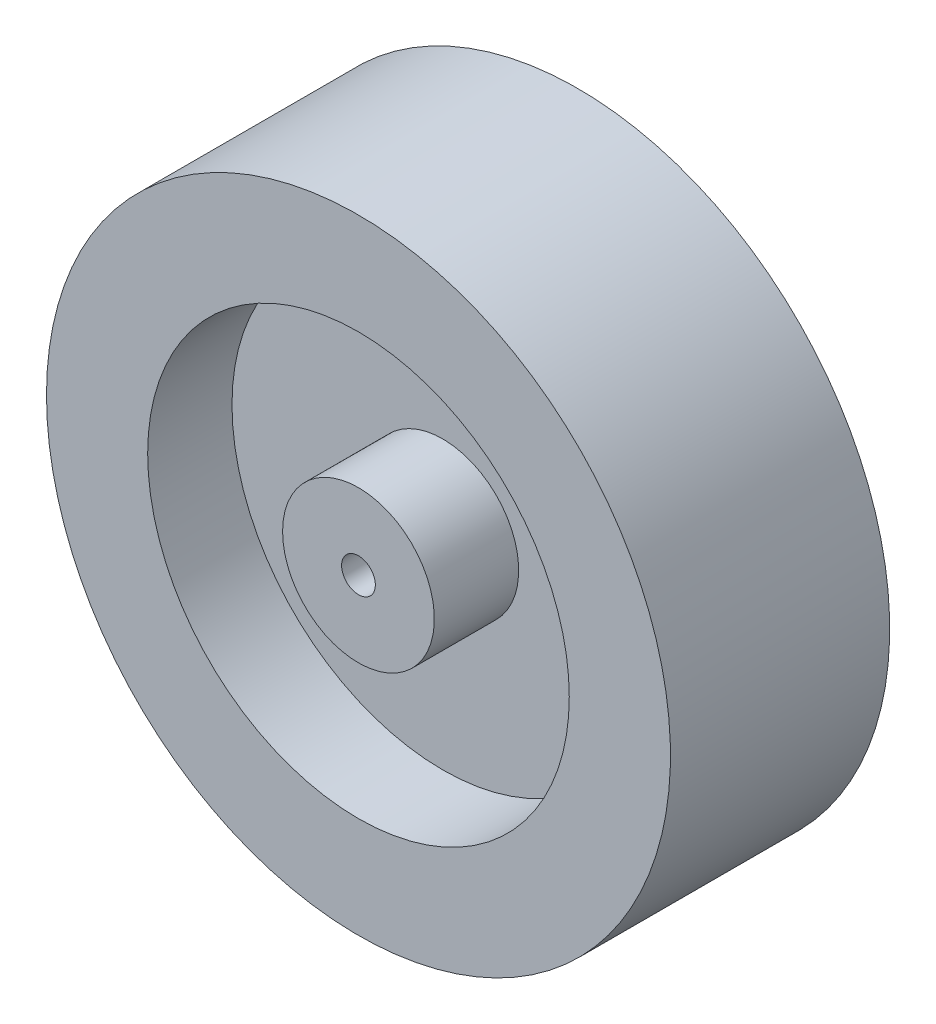
ISO-10303-21;
HEADER;
FILE_DESCRIPTION(('STEP AP214'),'2;1');
FILE_NAME('part.step','',(''),(''),'','','');
FILE_SCHEMA(('AUTOMOTIVE_DESIGN { 1 0 10303 214 1 1 1 1 }'));
ENDSEC;
DATA;
#1=APPLICATION_CONTEXT('core data for automotive mechanical design processes');
#2=APPLICATION_PROTOCOL_DEFINITION('international standard','automotive_design',2000,#1);
#3=PRODUCT_CONTEXT('',#1,'mechanical');
#4=PRODUCT('Part','Part','',(#3));
#5=PRODUCT_RELATED_PRODUCT_CATEGORY('part','',(#4));
#6=PRODUCT_DEFINITION_FORMATION('','',#4);
#7=PRODUCT_DEFINITION_CONTEXT('part definition',#1,'design');
#8=PRODUCT_DEFINITION('design','',#6,#7);
#9=PRODUCT_DEFINITION_SHAPE('','',#8);
#10=(LENGTH_UNIT() NAMED_UNIT(*) SI_UNIT(.MILLI.,.METRE.));
#11=(NAMED_UNIT(*) PLANE_ANGLE_UNIT() SI_UNIT($,.RADIAN.));
#12=(NAMED_UNIT(*) SI_UNIT($,.STERADIAN.) SOLID_ANGLE_UNIT());
#13=UNCERTAINTY_MEASURE_WITH_UNIT(LENGTH_MEASURE(1.E-05),#10,'distance_accuracy_value','');
#14=(GEOMETRIC_REPRESENTATION_CONTEXT(3) GLOBAL_UNCERTAINTY_ASSIGNED_CONTEXT((#13)) GLOBAL_UNIT_ASSIGNED_CONTEXT((#10,
#11,#12)) REPRESENTATION_CONTEXT('',''));
#15=CARTESIAN_POINT('',(0.,0.,0.));
#16=DIRECTION('',(0.,0.,1.));
#17=DIRECTION('',(1.,0.,0.));
#18=AXIS2_PLACEMENT_3D('',#15,#16,#17);
#19=CARTESIAN_POINT('',(0.,0.,26.));
#20=DIRECTION('',(0.,0.,1.));
#21=DIRECTION('',(1.,0.,0.));
#22=AXIS2_PLACEMENT_3D('',#19,#20,#21);
#23=PLANE('',#22);
#24=CARTESIAN_POINT('',(0.,0.,26.));
#25=DIRECTION('',(0.,0.,1.));
#26=DIRECTION('',(1.,0.,0.));
#27=AXIS2_PLACEMENT_3D('',#24,#25,#26);
#28=CIRCLE('',#27,2.);
#29=CARTESIAN_POINT('',(-2.,0.,26.));
#30=VERTEX_POINT('',#29);
#31=EDGE_CURVE('E50',#30,#30,#28,.T.);
#32=ORIENTED_EDGE('',*,*,#31,.F.);
#33=EDGE_LOOP('',(#32));
#34=FACE_BOUND('',#33,.T.);
#35=CARTESIAN_POINT('',(0.,0.,26.));
#36=DIRECTION('',(0.,0.,-1.));
#37=DIRECTION('',(-1.,0.,0.));
#38=AXIS2_PLACEMENT_3D('',#35,#36,#37);
#39=CIRCLE('',#38,9.);
#40=CARTESIAN_POINT('',(-9.,0.,26.));
#41=VERTEX_POINT('',#40);
#42=EDGE_CURVE('E84',#41,#41,#39,.T.);
#43=ORIENTED_EDGE('',*,*,#42,.F.);
#44=EDGE_LOOP('',(#43));
#45=FACE_BOUND('',#44,.T.);
#46=ADVANCED_FACE('F37',(#34,#45),#23,.T.);
#47=CARTESIAN_POINT('',(0.,0.,0.));
#48=DIRECTION('',(0.,0.,1.));
#49=DIRECTION('',(1.,0.,0.));
#50=AXIS2_PLACEMENT_3D('',#47,#48,#49);
#51=PLANE('',#50);
#52=CARTESIAN_POINT('',(0.,0.,0.));
#53=DIRECTION('',(0.,0.,1.));
#54=DIRECTION('',(1.,0.,0.));
#55=AXIS2_PLACEMENT_3D('',#52,#53,#54);
#56=CIRCLE('',#55,2.);
#57=CARTESIAN_POINT('',(-2.,0.,0.));
#58=VERTEX_POINT('',#57);
#59=EDGE_CURVE('E52',#58,#58,#56,.T.);
#60=ORIENTED_EDGE('',*,*,#59,.T.);
#61=EDGE_LOOP('',(#60));
#62=FACE_BOUND('',#61,.T.);
#63=CARTESIAN_POINT('',(0.,0.,0.));
#64=DIRECTION('',(0.,0.,-1.));
#65=DIRECTION('',(-1.,0.,0.));
#66=AXIS2_PLACEMENT_3D('',#63,#64,#65);
#67=CIRCLE('',#66,9.);
#68=CARTESIAN_POINT('',(-9.,0.,0.));
#69=VERTEX_POINT('',#68);
#70=EDGE_CURVE('E68',#69,#69,#67,.T.);
#71=ORIENTED_EDGE('',*,*,#70,.T.);
#72=EDGE_LOOP('',(#71));
#73=FACE_BOUND('',#72,.T.);
#74=ADVANCED_FACE('F102',(#62,#73),#51,.F.);
#75=CARTESIAN_POINT('',(0.,0.,26.));
#76=DIRECTION('',(0.,0.,-1.));
#77=DIRECTION('',(-1.,0.,0.));
#78=AXIS2_PLACEMENT_3D('',#75,#76,#77);
#79=CIRCLE('',#78,25.);
#80=CARTESIAN_POINT('',(-25.,0.,26.));
#81=VERTEX_POINT('',#80);
#82=EDGE_CURVE('E76',#81,#81,#79,.T.);
#83=ORIENTED_EDGE('',*,*,#82,.T.);
#84=EDGE_LOOP('',(#83));
#85=FACE_BOUND('',#84,.T.);
#86=CARTESIAN_POINT('',(0.,0.,26.));
#87=DIRECTION('',(0.,0.,1.));
#88=DIRECTION('',(1.,0.,0.));
#89=AXIS2_PLACEMENT_3D('',#86,#87,#88);
#90=CIRCLE('',#89,37.);
#91=CARTESIAN_POINT('',(-37.,0.,26.));
#92=VERTEX_POINT('',#91);
#93=EDGE_CURVE('E10',#92,#92,#90,.T.);
#94=ORIENTED_EDGE('',*,*,#93,.T.);
#95=EDGE_LOOP('',(#94));
#96=FACE_BOUND('',#95,.T.);
#97=ADVANCED_FACE('F105',(#85,#96),#23,.T.);
#98=CARTESIAN_POINT('',(0.,0.,0.));
#99=DIRECTION('',(0.,0.,-1.));
#100=DIRECTION('',(-1.,0.,0.));
#101=AXIS2_PLACEMENT_3D('',#98,#99,#100);
#102=CIRCLE('',#101,25.);
#103=CARTESIAN_POINT('',(-25.,0.,0.));
#104=VERTEX_POINT('',#103);
#105=EDGE_CURVE('E60',#104,#104,#102,.T.);
#106=ORIENTED_EDGE('',*,*,#105,.F.);
#107=EDGE_LOOP('',(#106));
#108=FACE_BOUND('',#107,.T.);
#109=CARTESIAN_POINT('',(0.,0.,0.));
#110=DIRECTION('',(0.,0.,1.));
#111=DIRECTION('',(1.,0.,0.));
#112=AXIS2_PLACEMENT_3D('',#109,#110,#111);
#113=CIRCLE('',#112,37.);
#114=CARTESIAN_POINT('',(-37.,0.,0.));
#115=VERTEX_POINT('',#114);
#116=EDGE_CURVE('E41',#115,#115,#113,.T.);
#117=ORIENTED_EDGE('',*,*,#116,.F.);
#118=EDGE_LOOP('',(#117));
#119=FACE_BOUND('',#118,.T.);
#120=ADVANCED_FACE('F110',(#108,#119),#51,.F.);
#121=CARTESIAN_POINT('',(0.,0.,26.));
#122=DIRECTION('',(0.,0.,-1.));
#123=DIRECTION('',(-1.,0.,0.));
#124=AXIS2_PLACEMENT_3D('',#121,#122,#123);
#125=CYLINDRICAL_SURFACE('',#124,37.);
#126=CARTESIAN_POINT('',(-37.,0.,26.));
#127=CARTESIAN_POINT('',(-37.,0.,25.7291666666667));
#128=CARTESIAN_POINT('',(-37.,0.,25.4583333333333));
#129=CARTESIAN_POINT('',(-37.,0.,24.9166666666667));
#130=CARTESIAN_POINT('',(-37.,0.,24.6458333333333));
#131=CARTESIAN_POINT('',(-37.,0.,24.1041666666667));
#132=CARTESIAN_POINT('',(-37.,0.,23.8333333333333));
#133=CARTESIAN_POINT('',(-37.,0.,23.2916666666667));
#134=CARTESIAN_POINT('',(-37.,0.,23.0208333333333));
#135=CARTESIAN_POINT('',(-37.,0.,22.4791666666667));
#136=CARTESIAN_POINT('',(-37.,0.,22.2083333333333));
#137=CARTESIAN_POINT('',(-37.,0.,21.6666666666667));
#138=CARTESIAN_POINT('',(-37.,0.,21.3958333333333));
#139=CARTESIAN_POINT('',(-37.,0.,20.8541666666667));
#140=CARTESIAN_POINT('',(-37.,0.,20.5833333333333));
#141=CARTESIAN_POINT('',(-37.,0.,20.0416666666667));
#142=CARTESIAN_POINT('',(-37.,0.,19.7708333333333));
#143=CARTESIAN_POINT('',(-37.,0.,19.2291666666667));
#144=CARTESIAN_POINT('',(-37.,0.,18.9583333333333));
#145=CARTESIAN_POINT('',(-37.,0.,18.4166666666667));
#146=CARTESIAN_POINT('',(-37.,0.,18.1458333333333));
#147=CARTESIAN_POINT('',(-37.,0.,17.6041666666667));
#148=CARTESIAN_POINT('',(-37.,0.,17.3333333333333));
#149=CARTESIAN_POINT('',(-37.,0.,16.7916666666667));
#150=CARTESIAN_POINT('',(-37.,0.,16.5208333333333));
#151=CARTESIAN_POINT('',(-37.,0.,15.9791666666667));
#152=CARTESIAN_POINT('',(-37.,0.,15.7083333333333));
#153=CARTESIAN_POINT('',(-37.,0.,15.1666666666667));
#154=CARTESIAN_POINT('',(-37.,0.,14.8958333333333));
#155=CARTESIAN_POINT('',(-37.,0.,14.3541666666667));
#156=CARTESIAN_POINT('',(-37.,0.,14.0833333333333));
#157=CARTESIAN_POINT('',(-37.,0.,13.5416666666667));
#158=CARTESIAN_POINT('',(-37.,0.,13.2708333333333));
#159=CARTESIAN_POINT('',(-37.,0.,12.7291666666667));
#160=CARTESIAN_POINT('',(-37.,0.,12.4583333333333));
#161=CARTESIAN_POINT('',(-37.,0.,11.9166666666667));
#162=CARTESIAN_POINT('',(-37.,0.,11.6458333333333));
#163=CARTESIAN_POINT('',(-37.,0.,11.1041666666667));
#164=CARTESIAN_POINT('',(-37.,0.,10.8333333333333));
#165=CARTESIAN_POINT('',(-37.,0.,10.2916666666667));
#166=CARTESIAN_POINT('',(-37.,0.,10.0208333333333));
#167=CARTESIAN_POINT('',(-37.,0.,9.47916666666667));
#168=CARTESIAN_POINT('',(-37.,0.,9.20833333333333));
#169=CARTESIAN_POINT('',(-37.,0.,8.66666666666667));
#170=CARTESIAN_POINT('',(-37.,0.,8.39583333333333));
#171=CARTESIAN_POINT('',(-37.,0.,7.85416666666667));
#172=CARTESIAN_POINT('',(-37.,0.,7.58333333333333));
#173=CARTESIAN_POINT('',(-37.,0.,7.04166666666667));
#174=CARTESIAN_POINT('',(-37.,0.,6.77083333333333));
#175=CARTESIAN_POINT('',(-37.,0.,6.22916666666667));
#176=CARTESIAN_POINT('',(-37.,0.,5.95833333333333));
#177=CARTESIAN_POINT('',(-37.,0.,5.41666666666667));
#178=CARTESIAN_POINT('',(-37.,0.,5.14583333333333));
#179=CARTESIAN_POINT('',(-37.,0.,4.60416666666667));
#180=CARTESIAN_POINT('',(-37.,0.,4.33333333333333));
#181=CARTESIAN_POINT('',(-37.,0.,3.79166666666667));
#182=CARTESIAN_POINT('',(-37.,0.,3.52083333333333));
#183=CARTESIAN_POINT('',(-37.,0.,2.97916666666667));
#184=CARTESIAN_POINT('',(-37.,0.,2.70833333333333));
#185=CARTESIAN_POINT('',(-37.,0.,2.16666666666667));
#186=CARTESIAN_POINT('',(-37.,0.,1.89583333333333));
#187=CARTESIAN_POINT('',(-37.,0.,1.35416666666667));
#188=CARTESIAN_POINT('',(-37.,0.,1.08333333333333));
#189=CARTESIAN_POINT('',(-37.,0.,0.541666666666667));
#190=CARTESIAN_POINT('',(-37.,0.,0.270833333333334));
#191=CARTESIAN_POINT('',(-37.,0.,0.));
#192=B_SPLINE_CURVE_WITH_KNOTS('',3,(#126,#127,#128,#129,#130,#131,#132,#133,#134,#135,#136,
#137,#138,#139,#140,#141,#142,#143,#144,#145,#146,#147,#148,#149,#150,#151,#152,#153,#154,#155,
#156,#157,#158,#159,#160,#161,#162,#163,#164,#165,#166,#167,#168,#169,#170,#171,#172,#173,#174,
#175,#176,#177,#178,#179,#180,#181,#182,#183,#184,#185,#186,#187,#188,#189,#190,#191),
.UNSPECIFIED.,.F.,.F.,(4,2,2,2,2,2,2,2,2,2,2,2,2,2,2,2,2,2,2,2,2,2,2,2,2,2,2,2,2,2,2,2,4),(0.,
0.812500000000001,1.625,2.4375,3.25,4.0625,4.875,5.6875,6.5,7.3125,8.125,8.9375,9.75,10.5625,
11.375,12.1875,13.,13.8125,14.625,15.4375,16.25,17.0625,17.875,18.6875,19.5,20.3125,21.125,
21.9375,22.75,23.5625,24.375,25.1875,26.),.UNSPECIFIED.);
#193=EDGE_CURVE('BSEAM39',#92,#115,#192,.T.);
#194=ORIENTED_EDGE('',*,*,#93,.F.);
#195=ORIENTED_EDGE('',*,*,#116,.T.);
#196=ORIENTED_EDGE('',*,*,#193,.T.);
#197=ORIENTED_EDGE('',*,*,#193,.F.);
#198=EDGE_LOOP('',(#194,#196,#195,#197));
#199=FACE_BOUND('',#198,.T.);
#200=ADVANCED_FACE('F39',(#199),#125,.T.);
#201=CARTESIAN_POINT('',(0.,0.,26.));
#202=DIRECTION('',(0.,0.,-1.));
#203=DIRECTION('',(-1.,0.,0.));
#204=AXIS2_PLACEMENT_3D('',#201,#202,#203);
#205=CYLINDRICAL_SURFACE('',#204,2.);
#206=CARTESIAN_POINT('',(-2.,0.,26.));
#207=CARTESIAN_POINT('',(-2.,0.,25.7291666666667));
#208=CARTESIAN_POINT('',(-2.,0.,25.4583333333333));
#209=CARTESIAN_POINT('',(-2.,0.,24.9166666666667));
#210=CARTESIAN_POINT('',(-2.,0.,24.6458333333333));
#211=CARTESIAN_POINT('',(-2.,0.,24.1041666666667));
#212=CARTESIAN_POINT('',(-2.,0.,23.8333333333333));
#213=CARTESIAN_POINT('',(-2.,0.,23.2916666666667));
#214=CARTESIAN_POINT('',(-2.,0.,23.0208333333333));
#215=CARTESIAN_POINT('',(-2.,0.,22.4791666666667));
#216=CARTESIAN_POINT('',(-2.,0.,22.2083333333333));
#217=CARTESIAN_POINT('',(-2.,0.,21.6666666666667));
#218=CARTESIAN_POINT('',(-2.,0.,21.3958333333333));
#219=CARTESIAN_POINT('',(-2.,0.,20.8541666666667));
#220=CARTESIAN_POINT('',(-2.,0.,20.5833333333333));
#221=CARTESIAN_POINT('',(-2.,0.,20.0416666666667));
#222=CARTESIAN_POINT('',(-2.,0.,19.7708333333333));
#223=CARTESIAN_POINT('',(-2.,0.,19.2291666666667));
#224=CARTESIAN_POINT('',(-2.,0.,18.9583333333333));
#225=CARTESIAN_POINT('',(-2.,0.,18.4166666666667));
#226=CARTESIAN_POINT('',(-2.,0.,18.1458333333333));
#227=CARTESIAN_POINT('',(-2.,0.,17.6041666666667));
#228=CARTESIAN_POINT('',(-2.,0.,17.3333333333333));
#229=CARTESIAN_POINT('',(-2.,0.,16.7916666666667));
#230=CARTESIAN_POINT('',(-2.,0.,16.5208333333333));
#231=CARTESIAN_POINT('',(-2.,0.,15.9791666666667));
#232=CARTESIAN_POINT('',(-2.,0.,15.7083333333333));
#233=CARTESIAN_POINT('',(-2.,0.,15.1666666666667));
#234=CARTESIAN_POINT('',(-2.,0.,14.8958333333333));
#235=CARTESIAN_POINT('',(-2.,0.,14.3541666666667));
#236=CARTESIAN_POINT('',(-2.,0.,14.0833333333333));
#237=CARTESIAN_POINT('',(-2.,0.,13.5416666666667));
#238=CARTESIAN_POINT('',(-2.,0.,13.2708333333333));
#239=CARTESIAN_POINT('',(-2.,0.,12.7291666666667));
#240=CARTESIAN_POINT('',(-2.,0.,12.4583333333333));
#241=CARTESIAN_POINT('',(-2.,0.,11.9166666666667));
#242=CARTESIAN_POINT('',(-2.,0.,11.6458333333333));
#243=CARTESIAN_POINT('',(-2.,0.,11.1041666666667));
#244=CARTESIAN_POINT('',(-2.,0.,10.8333333333333));
#245=CARTESIAN_POINT('',(-2.,0.,10.2916666666667));
#246=CARTESIAN_POINT('',(-2.,0.,10.0208333333333));
#247=CARTESIAN_POINT('',(-2.,0.,9.47916666666667));
#248=CARTESIAN_POINT('',(-2.,0.,9.20833333333333));
#249=CARTESIAN_POINT('',(-2.,0.,8.66666666666667));
#250=CARTESIAN_POINT('',(-2.,0.,8.39583333333333));
#251=CARTESIAN_POINT('',(-2.,0.,7.85416666666667));
#252=CARTESIAN_POINT('',(-2.,0.,7.58333333333333));
#253=CARTESIAN_POINT('',(-2.,0.,7.04166666666667));
#254=CARTESIAN_POINT('',(-2.,0.,6.77083333333333));
#255=CARTESIAN_POINT('',(-2.,0.,6.22916666666667));
#256=CARTESIAN_POINT('',(-2.,0.,5.95833333333333));
#257=CARTESIAN_POINT('',(-2.,0.,5.41666666666667));
#258=CARTESIAN_POINT('',(-2.,0.,5.14583333333333));
#259=CARTESIAN_POINT('',(-2.,0.,4.60416666666667));
#260=CARTESIAN_POINT('',(-2.,0.,4.33333333333333));
#261=CARTESIAN_POINT('',(-2.,0.,3.79166666666667));
#262=CARTESIAN_POINT('',(-2.,0.,3.52083333333333));
#263=CARTESIAN_POINT('',(-2.,0.,2.97916666666667));
#264=CARTESIAN_POINT('',(-2.,0.,2.70833333333333));
#265=CARTESIAN_POINT('',(-2.,0.,2.16666666666667));
#266=CARTESIAN_POINT('',(-2.,0.,1.89583333333333));
#267=CARTESIAN_POINT('',(-2.,0.,1.35416666666667));
#268=CARTESIAN_POINT('',(-2.,0.,1.08333333333333));
#269=CARTESIAN_POINT('',(-2.,0.,0.541666666666667));
#270=CARTESIAN_POINT('',(-2.,0.,0.270833333333334));
#271=CARTESIAN_POINT('',(-2.,0.,0.));
#272=B_SPLINE_CURVE_WITH_KNOTS('',3,(#206,#207,#208,#209,#210,#211,#212,#213,#214,#215,#216,
#217,#218,#219,#220,#221,#222,#223,#224,#225,#226,#227,#228,#229,#230,#231,#232,#233,#234,#235,
#236,#237,#238,#239,#240,#241,#242,#243,#244,#245,#246,#247,#248,#249,#250,#251,#252,#253,#254,
#255,#256,#257,#258,#259,#260,#261,#262,#263,#264,#265,#266,#267,#268,#269,#270,#271),
.UNSPECIFIED.,.F.,.F.,(4,2,2,2,2,2,2,2,2,2,2,2,2,2,2,2,2,2,2,2,2,2,2,2,2,2,2,2,2,2,2,2,4),(0.,
0.812500000000001,1.625,2.4375,3.25,4.0625,4.875,5.6875,6.5,7.3125,8.125,8.9375,9.75,10.5625,
11.375,12.1875,13.,13.8125,14.625,15.4375,16.25,17.0625,17.875,18.6875,19.5,20.3125,21.125,
21.9375,22.75,23.5625,24.375,25.1875,26.),.UNSPECIFIED.);
#273=EDGE_CURVE('BSEAM140',#30,#58,#272,.T.);
#274=ORIENTED_EDGE('',*,*,#31,.T.);
#275=ORIENTED_EDGE('',*,*,#59,.F.);
#276=ORIENTED_EDGE('',*,*,#273,.T.);
#277=ORIENTED_EDGE('',*,*,#273,.F.);
#278=EDGE_LOOP('',(#274,#276,#275,#277));
#279=FACE_BOUND('',#278,.T.);
#280=ADVANCED_FACE('F140',(#279),#205,.F.);
#281=CARTESIAN_POINT('',(0.,0.,10.));
#282=DIRECTION('',(0.,0.,-1.));
#283=DIRECTION('',(-1.,0.,0.));
#284=AXIS2_PLACEMENT_3D('',#281,#282,#283);
#285=CYLINDRICAL_SURFACE('',#284,25.);
#286=CARTESIAN_POINT('',(0.,0.,10.));
#287=DIRECTION('',(0.,0.,-1.));
#288=DIRECTION('',(-1.,0.,0.));
#289=AXIS2_PLACEMENT_3D('',#286,#287,#288);
#290=CIRCLE('',#289,25.);
#291=CARTESIAN_POINT('',(-25.,0.,10.));
#292=VERTEX_POINT('',#291);
#293=EDGE_CURVE('E56',#292,#292,#290,.T.);
#294=ORIENTED_EDGE('',*,*,#293,.F.);
#295=EDGE_LOOP('',(#294));
#296=FACE_BOUND('',#295,.T.);
#297=ORIENTED_EDGE('',*,*,#105,.T.);
#298=EDGE_LOOP('',(#297));
#299=FACE_BOUND('',#298,.T.);
#300=ADVANCED_FACE('F137',(#296,#299),#285,.F.);
#301=CARTESIAN_POINT('',(0.,0.,10.));
#302=DIRECTION('',(0.,0.,-1.));
#303=DIRECTION('',(-1.,0.,0.));
#304=AXIS2_PLACEMENT_3D('',#301,#302,#303);
#305=PLANE('',#304);
#306=CARTESIAN_POINT('',(0.,0.,10.));
#307=DIRECTION('',(0.,0.,-1.));
#308=DIRECTION('',(-1.,0.,0.));
#309=AXIS2_PLACEMENT_3D('',#306,#307,#308);
#310=CIRCLE('',#309,9.);
#311=CARTESIAN_POINT('',(-9.,0.,10.));
#312=VERTEX_POINT('',#311);
#313=EDGE_CURVE('E64',#312,#312,#310,.T.);
#314=ORIENTED_EDGE('',*,*,#313,.F.);
#315=EDGE_LOOP('',(#314));
#316=FACE_BOUND('',#315,.T.);
#317=ORIENTED_EDGE('',*,*,#293,.T.);
#318=EDGE_LOOP('',(#317));
#319=FACE_BOUND('',#318,.T.);
#320=ADVANCED_FACE('F133',(#316,#319),#305,.T.);
#321=CARTESIAN_POINT('',(0.,0.,10.));
#322=DIRECTION('',(0.,0.,-1.));
#323=DIRECTION('',(-1.,0.,0.));
#324=AXIS2_PLACEMENT_3D('',#321,#322,#323);
#325=CYLINDRICAL_SURFACE('',#324,9.);
#326=ORIENTED_EDGE('',*,*,#313,.T.);
#327=EDGE_LOOP('',(#326));
#328=FACE_BOUND('',#327,.T.);
#329=ORIENTED_EDGE('',*,*,#70,.F.);
#330=EDGE_LOOP('',(#329));
#331=FACE_BOUND('',#330,.T.);
#332=ADVANCED_FACE('F127',(#328,#331),#325,.T.);
#333=CARTESIAN_POINT('',(0.,0.,16.));
#334=DIRECTION('',(0.,0.,1.));
#335=DIRECTION('',(-1.,0.,0.));
#336=AXIS2_PLACEMENT_3D('',#333,#334,#335);
#337=PLANE('',#336);
#338=CARTESIAN_POINT('',(0.,0.,16.));
#339=DIRECTION('',(0.,0.,-1.));
#340=DIRECTION('',(-1.,0.,0.));
#341=AXIS2_PLACEMENT_3D('',#338,#339,#340);
#342=CIRCLE('',#341,25.);
#343=CARTESIAN_POINT('',(-25.,0.,16.));
#344=VERTEX_POINT('',#343);
#345=EDGE_CURVE('E72',#344,#344,#342,.T.);
#346=ORIENTED_EDGE('',*,*,#345,.F.);
#347=EDGE_LOOP('',(#346));
#348=FACE_BOUND('',#347,.T.);
#349=CARTESIAN_POINT('',(0.,0.,16.));
#350=DIRECTION('',(0.,0.,-1.));
#351=DIRECTION('',(-1.,0.,0.));
#352=AXIS2_PLACEMENT_3D('',#349,#350,#351);
#353=CIRCLE('',#352,9.);
#354=CARTESIAN_POINT('',(-9.,0.,16.));
#355=VERTEX_POINT('',#354);
#356=EDGE_CURVE('E80',#355,#355,#353,.T.);
#357=ORIENTED_EDGE('',*,*,#356,.T.);
#358=EDGE_LOOP('',(#357));
#359=FACE_BOUND('',#358,.T.);
#360=ADVANCED_FACE('F92',(#348,#359),#337,.T.);
#361=CARTESIAN_POINT('',(0.,0.,16.));
#362=DIRECTION('',(0.,0.,1.));
#363=DIRECTION('',(1.,0.,0.));
#364=AXIS2_PLACEMENT_3D('',#361,#362,#363);
#365=CYLINDRICAL_SURFACE('',#364,25.);
#366=ORIENTED_EDGE('',*,*,#345,.T.);
#367=EDGE_LOOP('',(#366));
#368=FACE_BOUND('',#367,.T.);
#369=ORIENTED_EDGE('',*,*,#82,.F.);
#370=EDGE_LOOP('',(#369));
#371=FACE_BOUND('',#370,.T.);
#372=ADVANCED_FACE('F97',(#368,#371),#365,.F.);
#373=CARTESIAN_POINT('',(0.,0.,16.));
#374=DIRECTION('',(0.,0.,1.));
#375=DIRECTION('',(1.,0.,0.));
#376=AXIS2_PLACEMENT_3D('',#373,#374,#375);
#377=CYLINDRICAL_SURFACE('',#376,9.);
#378=ORIENTED_EDGE('',*,*,#356,.F.);
#379=EDGE_LOOP('',(#378));
#380=FACE_BOUND('',#379,.T.);
#381=ORIENTED_EDGE('',*,*,#42,.T.);
#382=EDGE_LOOP('',(#381));
#383=FACE_BOUND('',#382,.T.);
#384=ADVANCED_FACE('F94',(#380,#383),#377,.T.);
#385=CLOSED_SHELL('',(#46,#74,#97,#120,#200,#280,#300,#320,#332,#360,#372,#384));
#386=MANIFOLD_SOLID_BREP('B2',#385);
#387=ADVANCED_BREP_SHAPE_REPRESENTATION('',(#18,#386),#14);
#388=SHAPE_DEFINITION_REPRESENTATION(#9,#387);
ENDSEC;
END-ISO-10303-21;
